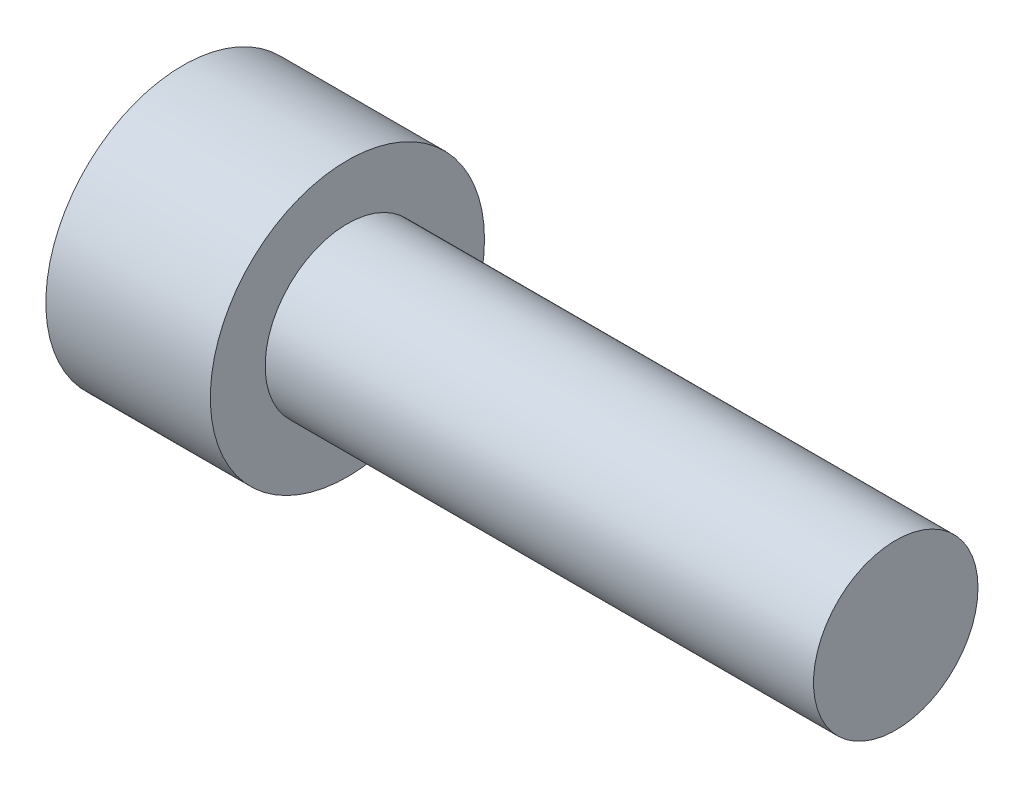
ISO-10303-21;
HEADER;
FILE_DESCRIPTION(('STEP AP214'),'2;1');
FILE_NAME('part.step','',(''),(''),'','','');
FILE_SCHEMA(('AUTOMOTIVE_DESIGN { 1 0 10303 214 1 1 1 1 }'));
ENDSEC;
DATA;
#1=APPLICATION_CONTEXT('core data for automotive mechanical design processes');
#2=APPLICATION_PROTOCOL_DEFINITION('international standard','automotive_design',2000,#1);
#3=PRODUCT_CONTEXT('',#1,'mechanical');
#4=PRODUCT('Part','Part','',(#3));
#5=PRODUCT_RELATED_PRODUCT_CATEGORY('part','',(#4));
#6=PRODUCT_DEFINITION_FORMATION('','',#4);
#7=PRODUCT_DEFINITION_CONTEXT('part definition',#1,'design');
#8=PRODUCT_DEFINITION('design','',#6,#7);
#9=PRODUCT_DEFINITION_SHAPE('','',#8);
#10=(LENGTH_UNIT() NAMED_UNIT(*) SI_UNIT(.MILLI.,.METRE.));
#11=(NAMED_UNIT(*) PLANE_ANGLE_UNIT() SI_UNIT($,.RADIAN.));
#12=(NAMED_UNIT(*) SI_UNIT($,.STERADIAN.) SOLID_ANGLE_UNIT());
#13=UNCERTAINTY_MEASURE_WITH_UNIT(LENGTH_MEASURE(1.E-05),#10,'distance_accuracy_value','');
#14=(GEOMETRIC_REPRESENTATION_CONTEXT(3) GLOBAL_UNCERTAINTY_ASSIGNED_CONTEXT((#13)) GLOBAL_UNIT_ASSIGNED_CONTEXT((#10,
#11,#12)) REPRESENTATION_CONTEXT('',''));
#15=CARTESIAN_POINT('',(0.,0.,0.));
#16=DIRECTION('',(0.,0.,1.));
#17=DIRECTION('',(1.,0.,0.));
#18=AXIS2_PLACEMENT_3D('',#15,#16,#17);
#19=CARTESIAN_POINT('',(0.,0.,0.));
#20=DIRECTION('',(-1.,0.,0.));
#21=DIRECTION('',(0.,0.,1.));
#22=AXIS2_PLACEMENT_3D('',#19,#20,#21);
#23=PLANE('',#22);
#24=CARTESIAN_POINT('',(0.,0.,0.));
#25=DIRECTION('',(1.,0.,0.));
#26=DIRECTION('',(0.,0.,-1.));
#27=AXIS2_PLACEMENT_3D('',#24,#25,#26);
#28=CIRCLE('',#27,2.5);
#29=CARTESIAN_POINT('',(0.,0.,-2.5));
#30=VERTEX_POINT('',#29);
#31=EDGE_CURVE('E10',#30,#30,#28,.T.);
#32=ORIENTED_EDGE('',*,*,#31,.F.);
#33=EDGE_LOOP('',(#32));
#34=FACE_BOUND('',#33,.T.);
#35=ADVANCED_FACE('F37',(#34),#23,.T.);
#36=CARTESIAN_POINT('',(13.,0.,0.));
#37=DIRECTION('',(1.,0.,0.));
#38=DIRECTION('',(0.,0.,-1.));
#39=AXIS2_PLACEMENT_3D('',#36,#37,#38);
#40=CYLINDRICAL_SURFACE('',#39,2.5);
#41=ORIENTED_EDGE('',*,*,#31,.T.);
#42=EDGE_LOOP('',(#41));
#43=FACE_BOUND('',#42,.T.);
#44=CARTESIAN_POINT('',(3.,0.,0.));
#45=DIRECTION('',(1.,0.,0.));
#46=DIRECTION('',(0.,0.,-1.));
#47=AXIS2_PLACEMENT_3D('',#44,#45,#46);
#48=CIRCLE('',#47,2.5);
#49=CARTESIAN_POINT('',(3.,0.,-2.5));
#50=VERTEX_POINT('',#49);
#51=EDGE_CURVE('E44',#50,#50,#48,.T.);
#52=ORIENTED_EDGE('',*,*,#51,.F.);
#53=EDGE_LOOP('',(#52));
#54=FACE_BOUND('',#53,.T.);
#55=ADVANCED_FACE('F73',(#43,#54),#40,.T.);
#56=CARTESIAN_POINT('',(3.,0.,-2.5));
#57=DIRECTION('',(1.,0.,0.));
#58=DIRECTION('',(0.,0.,-1.));
#59=AXIS2_PLACEMENT_3D('',#56,#57,#58);
#60=PLANE('',#59);
#61=ORIENTED_EDGE('',*,*,#51,.T.);
#62=EDGE_LOOP('',(#61));
#63=FACE_BOUND('',#62,.T.);
#64=CARTESIAN_POINT('',(3.,0.,0.));
#65=DIRECTION('',(1.,0.,0.));
#66=DIRECTION('',(0.,0.,-1.));
#67=AXIS2_PLACEMENT_3D('',#64,#65,#66);
#68=CIRCLE('',#67,1.5);
#69=CARTESIAN_POINT('',(3.,0.,-1.5));
#70=VERTEX_POINT('',#69);
#71=EDGE_CURVE('E49',#70,#70,#68,.T.);
#72=ORIENTED_EDGE('',*,*,#71,.F.);
#73=EDGE_LOOP('',(#72));
#74=FACE_BOUND('',#73,.T.);
#75=ADVANCED_FACE('F65',(#63,#74),#60,.T.);
#76=CARTESIAN_POINT('',(13.,0.,0.));
#77=DIRECTION('',(1.,0.,0.));
#78=DIRECTION('',(0.,0.,-1.));
#79=AXIS2_PLACEMENT_3D('',#76,#77,#78);
#80=CYLINDRICAL_SURFACE('',#79,1.5);
#81=ORIENTED_EDGE('',*,*,#71,.T.);
#82=EDGE_LOOP('',(#81));
#83=FACE_BOUND('',#82,.T.);
#84=CARTESIAN_POINT('',(13.,0.,0.));
#85=DIRECTION('',(1.,0.,0.));
#86=DIRECTION('',(0.,0.,-1.));
#87=AXIS2_PLACEMENT_3D('',#84,#85,#86);
#88=CIRCLE('',#87,1.5);
#89=CARTESIAN_POINT('',(13.,0.,-1.5));
#90=VERTEX_POINT('',#89);
#91=EDGE_CURVE('E54',#90,#90,#88,.T.);
#92=ORIENTED_EDGE('',*,*,#91,.F.);
#93=EDGE_LOOP('',(#92));
#94=FACE_BOUND('',#93,.T.);
#95=ADVANCED_FACE('F63',(#83,#94),#80,.T.);
#96=CARTESIAN_POINT('',(13.,0.,-1.5));
#97=DIRECTION('',(1.,0.,0.));
#98=DIRECTION('',(0.,0.,-1.));
#99=AXIS2_PLACEMENT_3D('',#96,#97,#98);
#100=PLANE('',#99);
#101=ORIENTED_EDGE('',*,*,#91,.T.);
#102=EDGE_LOOP('',(#101));
#103=FACE_BOUND('',#102,.T.);
#104=ADVANCED_FACE('F61',(#103),#100,.T.);
#105=CLOSED_SHELL('',(#35,#55,#75,#95,#104));
#106=MANIFOLD_SOLID_BREP('B2',#105);
#107=ADVANCED_BREP_SHAPE_REPRESENTATION('',(#18,#106),#14);
#108=SHAPE_DEFINITION_REPRESENTATION(#9,#107);
ENDSEC;
END-ISO-10303-21;
